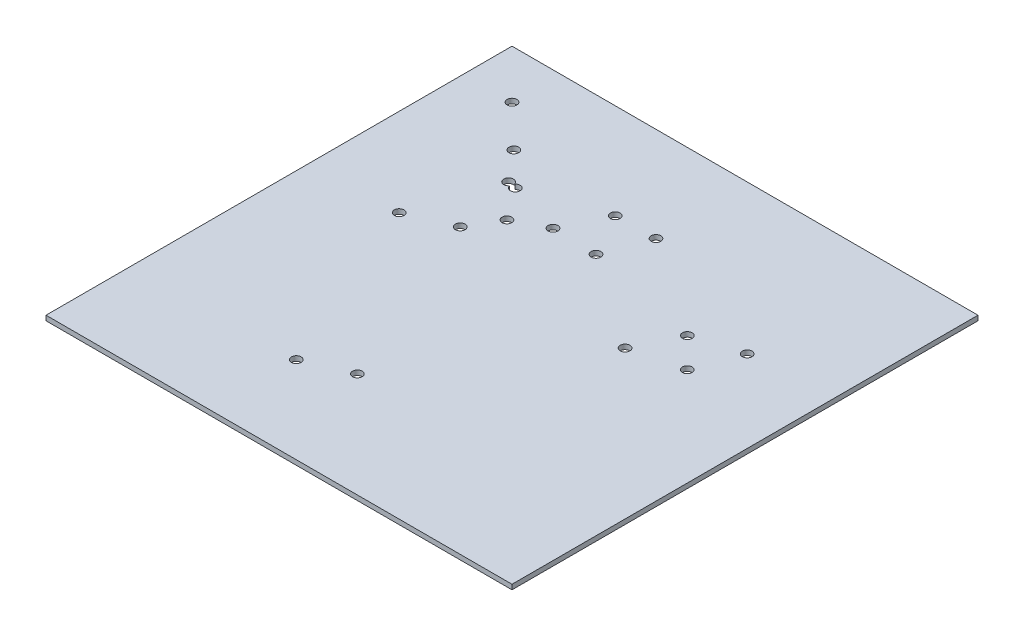
ISO-10303-21;
HEADER;
FILE_DESCRIPTION(('STEP AP214'),'2;1');
FILE_NAME('part.step','',(''),(''),'','','');
FILE_SCHEMA(('AUTOMOTIVE_DESIGN { 1 0 10303 214 1 1 1 1 }'));
ENDSEC;
DATA;
#1=APPLICATION_CONTEXT('core data for automotive mechanical design processes');
#2=APPLICATION_PROTOCOL_DEFINITION('international standard','automotive_design',2000,#1);
#3=PRODUCT_CONTEXT('',#1,'mechanical');
#4=PRODUCT('Part','Part','',(#3));
#5=PRODUCT_RELATED_PRODUCT_CATEGORY('part','',(#4));
#6=PRODUCT_DEFINITION_FORMATION('','',#4);
#7=PRODUCT_DEFINITION_CONTEXT('part definition',#1,'design');
#8=PRODUCT_DEFINITION('design','',#6,#7);
#9=PRODUCT_DEFINITION_SHAPE('','',#8);
#10=(LENGTH_UNIT() NAMED_UNIT(*) SI_UNIT(.MILLI.,.METRE.));
#11=(NAMED_UNIT(*) PLANE_ANGLE_UNIT() SI_UNIT($,.RADIAN.));
#12=(NAMED_UNIT(*) SI_UNIT($,.STERADIAN.) SOLID_ANGLE_UNIT());
#13=UNCERTAINTY_MEASURE_WITH_UNIT(LENGTH_MEASURE(1.E-05),#10,'distance_accuracy_value','');
#14=(GEOMETRIC_REPRESENTATION_CONTEXT(3) GLOBAL_UNCERTAINTY_ASSIGNED_CONTEXT((#13)) GLOBAL_UNIT_ASSIGNED_CONTEXT((#10,
#11,#12)) REPRESENTATION_CONTEXT('',''));
#15=CARTESIAN_POINT('',(0.,0.,0.));
#16=DIRECTION('',(0.,0.,1.));
#17=DIRECTION('',(1.,0.,0.));
#18=AXIS2_PLACEMENT_3D('',#15,#16,#17);
#19=CARTESIAN_POINT('',(-152.4,3.175,0.));
#20=DIRECTION('',(-1.,0.,0.));
#21=DIRECTION('',(0.,0.,1.));
#22=AXIS2_PLACEMENT_3D('',#19,#20,#21);
#23=PLANE('',#22);
#24=DIRECTION('',(0.,0.,-1.));
#25=VECTOR('',#24,1.);
#26=CARTESIAN_POINT('',(-152.4,0.,0.));
#27=LINE('',#26,#25);
#28=CARTESIAN_POINT('',(-152.4,0.,152.4));
#29=VERTEX_POINT('',#28);
#30=CARTESIAN_POINT('',(-152.4,0.,-152.4));
#31=VERTEX_POINT('',#30);
#32=EDGE_CURVE('E187',#29,#31,#27,.T.);
#33=ORIENTED_EDGE('',*,*,#32,.F.);
#34=DIRECTION('',(0.,-1.,0.));
#35=VECTOR('',#34,1.);
#36=CARTESIAN_POINT('',(-152.4,3.175,152.4));
#37=LINE('',#36,#35);
#38=CARTESIAN_POINT('',(-152.4,3.175,152.4));
#39=VERTEX_POINT('',#38);
#40=EDGE_CURVE('E11',#39,#29,#37,.T.);
#41=ORIENTED_EDGE('',*,*,#40,.F.);
#42=DIRECTION('',(0.,0.,-1.));
#43=VECTOR('',#42,1.);
#44=CARTESIAN_POINT('',(-152.4,3.175,0.));
#45=LINE('',#44,#43);
#46=CARTESIAN_POINT('',(-152.4,3.175,-152.4));
#47=VERTEX_POINT('',#46);
#48=EDGE_CURVE('E125',#39,#47,#45,.T.);
#49=ORIENTED_EDGE('',*,*,#48,.T.);
#50=DIRECTION('',(0.,-1.,0.));
#51=VECTOR('',#50,1.);
#52=CARTESIAN_POINT('',(-152.4,3.175,-152.4));
#53=LINE('',#52,#51);
#54=EDGE_CURVE('E90',#47,#31,#53,.T.);
#55=ORIENTED_EDGE('',*,*,#54,.T.);
#56=EDGE_LOOP('',(#33,#41,#49,#55));
#57=FACE_BOUND('',#56,.T.);
#58=ADVANCED_FACE('F39',(#57),#23,.T.);
#59=CARTESIAN_POINT('',(0.,3.175,152.4));
#60=DIRECTION('',(0.,0.,1.));
#61=DIRECTION('',(1.,0.,0.));
#62=AXIS2_PLACEMENT_3D('',#59,#60,#61);
#63=PLANE('',#62);
#64=DIRECTION('',(-1.,0.,0.));
#65=VECTOR('',#64,1.);
#66=CARTESIAN_POINT('',(0.,0.,152.4));
#67=LINE('',#66,#65);
#68=CARTESIAN_POINT('',(152.4,0.,152.4));
#69=VERTEX_POINT('',#68);
#70=EDGE_CURVE('E115',#69,#29,#67,.T.);
#71=ORIENTED_EDGE('',*,*,#70,.F.);
#72=DIRECTION('',(0.,-1.,0.));
#73=VECTOR('',#72,1.);
#74=CARTESIAN_POINT('',(152.4,3.175,152.4));
#75=LINE('',#74,#73);
#76=CARTESIAN_POINT('',(152.4,3.175,152.4));
#77=VERTEX_POINT('',#76);
#78=EDGE_CURVE('E49',#77,#69,#75,.T.);
#79=ORIENTED_EDGE('',*,*,#78,.F.);
#80=DIRECTION('',(-1.,0.,0.));
#81=VECTOR('',#80,1.);
#82=CARTESIAN_POINT('',(0.,3.175,152.4));
#83=LINE('',#82,#81);
#84=EDGE_CURVE('E113',#77,#39,#83,.T.);
#85=ORIENTED_EDGE('',*,*,#84,.T.);
#86=ORIENTED_EDGE('',*,*,#40,.T.);
#87=EDGE_LOOP('',(#71,#79,#85,#86));
#88=FACE_BOUND('',#87,.T.);
#89=ADVANCED_FACE('F111',(#88),#63,.T.);
#90=CARTESIAN_POINT('',(152.4,3.175,0.));
#91=DIRECTION('',(-1.,0.,0.));
#92=DIRECTION('',(0.,0.,1.));
#93=AXIS2_PLACEMENT_3D('',#90,#91,#92);
#94=PLANE('',#93);
#95=DIRECTION('',(0.,0.,-1.));
#96=VECTOR('',#95,1.);
#97=CARTESIAN_POINT('',(152.4,0.,0.));
#98=LINE('',#97,#96);
#99=CARTESIAN_POINT('',(152.4,0.,-152.4));
#100=VERTEX_POINT('',#99);
#101=EDGE_CURVE('E190',#69,#100,#98,.T.);
#102=ORIENTED_EDGE('',*,*,#101,.T.);
#103=DIRECTION('',(0.,-1.,0.));
#104=VECTOR('',#103,1.);
#105=CARTESIAN_POINT('',(152.4,3.175,-152.4));
#106=LINE('',#105,#104);
#107=CARTESIAN_POINT('',(152.4,3.175,-152.4));
#108=VERTEX_POINT('',#107);
#109=EDGE_CURVE('E118',#108,#100,#106,.T.);
#110=ORIENTED_EDGE('',*,*,#109,.F.);
#111=DIRECTION('',(0.,0.,-1.));
#112=VECTOR('',#111,1.);
#113=CARTESIAN_POINT('',(152.4,3.175,0.));
#114=LINE('',#113,#112);
#115=EDGE_CURVE('E121',#77,#108,#114,.T.);
#116=ORIENTED_EDGE('',*,*,#115,.F.);
#117=ORIENTED_EDGE('',*,*,#78,.T.);
#118=EDGE_LOOP('',(#102,#110,#116,#117));
#119=FACE_BOUND('',#118,.T.);
#120=ADVANCED_FACE('F122',(#119),#94,.F.);
#121=CARTESIAN_POINT('',(-70.9883003397646,3.175,-73.1341747517776));
#122=DIRECTION('',(0.,-1.,0.));
#123=DIRECTION('',(0.,0.,-1.));
#124=AXIS2_PLACEMENT_3D('',#121,#122,#123);
#125=CYLINDRICAL_SURFACE('',#124,3.175);
#126=CARTESIAN_POINT('',(-70.9883003397646,0.,-73.1341747517776));
#127=DIRECTION('',(0.,1.,0.));
#128=DIRECTION('',(0.,0.,1.));
#129=AXIS2_PLACEMENT_3D('',#126,#127,#128);
#130=CIRCLE('',#129,3.175);
#131=CARTESIAN_POINT('',(-74.1032331754784,0.,-72.5195053861898));
#132=VERTEX_POINT('',#131);
#133=CARTESIAN_POINT('',(-73.2823806353811,0.,-75.3291281902961));
#134=VERTEX_POINT('',#133);
#135=EDGE_CURVE('E133',#132,#134,#130,.T.);
#136=ORIENTED_EDGE('',*,*,#135,.F.);
#137=DIRECTION('',(0.,-1.,0.));
#138=VECTOR('',#137,1.);
#139=CARTESIAN_POINT('',(-74.1032331754784,3.175,-72.5195053861898));
#140=LINE('',#139,#138);
#141=CARTESIAN_POINT('',(-74.1032331754784,3.175,-72.5195053861898));
#142=VERTEX_POINT('',#141);
#143=EDGE_CURVE('E43',#142,#132,#140,.T.);
#144=ORIENTED_EDGE('',*,*,#143,.F.);
#145=CARTESIAN_POINT('',(-70.9883003397646,3.175,-73.1341747517776));
#146=DIRECTION('',(0.,1.,0.));
#147=DIRECTION('',(0.,0.,1.));
#148=AXIS2_PLACEMENT_3D('',#145,#146,#147);
#149=CIRCLE('',#148,3.175);
#150=CARTESIAN_POINT('',(-73.2823806353811,3.175,-75.3291281902961));
#151=VERTEX_POINT('',#150);
#152=EDGE_CURVE('E193',#142,#151,#149,.T.);
#153=ORIENTED_EDGE('',*,*,#152,.T.);
#154=DIRECTION('',(0.,-1.,0.));
#155=VECTOR('',#154,1.);
#156=CARTESIAN_POINT('',(-73.2823806353811,3.175,-75.3291281902961));
#157=LINE('',#156,#155);
#158=EDGE_CURVE('E132',#151,#134,#157,.T.);
#159=ORIENTED_EDGE('',*,*,#158,.T.);
#160=EDGE_LOOP('',(#136,#144,#153,#159));
#161=FACE_BOUND('',#160,.T.);
#162=ADVANCED_FACE('F41',(#161),#125,.F.);
#163=CARTESIAN_POINT('',(-76.6509639264033,3.175,-74.414153907893));
#164=DIRECTION('',(0.,-1.,0.));
#165=DIRECTION('',(0.,0.,-1.));
#166=AXIS2_PLACEMENT_3D('',#163,#164,#165);
#167=CYLINDRICAL_SURFACE('',#166,3.175);
#168=CARTESIAN_POINT('',(-76.6509639264033,0.,-74.414153907893));
#169=DIRECTION('',(0.,1.,0.));
#170=DIRECTION('',(0.,0.,1.));
#171=AXIS2_PLACEMENT_3D('',#168,#169,#170);
#172=CIRCLE('',#171,3.175);
#173=CARTESIAN_POINT('',(-73.812117445062,0.,-75.8359751538224));
#174=VERTEX_POINT('',#173);
#175=EDGE_CURVE('E136',#174,#132,#172,.T.);
#176=ORIENTED_EDGE('',*,*,#175,.F.);
#177=DIRECTION('',(0.,-1.,0.));
#178=VECTOR('',#177,1.);
#179=CARTESIAN_POINT('',(-73.812117445062,3.175,-75.8359751538224));
#180=LINE('',#179,#178);
#181=CARTESIAN_POINT('',(-73.812117445062,3.175,-75.8359751538224));
#182=VERTEX_POINT('',#181);
#183=EDGE_CURVE('E196',#182,#174,#180,.T.);
#184=ORIENTED_EDGE('',*,*,#183,.F.);
#185=CARTESIAN_POINT('',(-76.6509639264033,3.175,-74.414153907893));
#186=DIRECTION('',(0.,1.,0.));
#187=DIRECTION('',(0.,0.,1.));
#188=AXIS2_PLACEMENT_3D('',#185,#186,#187);
#189=CIRCLE('',#188,3.175);
#190=EDGE_CURVE('E205',#182,#142,#189,.T.);
#191=ORIENTED_EDGE('',*,*,#190,.T.);
#192=ORIENTED_EDGE('',*,*,#143,.T.);
#193=EDGE_LOOP('',(#176,#184,#191,#192));
#194=FACE_BOUND('',#193,.T.);
#195=ADVANCED_FACE('F203',(#194),#167,.F.);
#196=CARTESIAN_POINT('',(-120.65,3.175,-120.65));
#197=DIRECTION('',(0.,-1.,0.));
#198=DIRECTION('',(0.,0.,-1.));
#199=AXIS2_PLACEMENT_3D('',#196,#197,#198);
#200=CYLINDRICAL_SURFACE('',#199,3.175);
#201=CARTESIAN_POINT('',(-120.65,3.175,-120.65));
#202=DIRECTION('',(0.,1.,0.));
#203=DIRECTION('',(0.,0.,1.));
#204=AXIS2_PLACEMENT_3D('',#201,#202,#203);
#205=CIRCLE('',#204,3.175);
#206=CARTESIAN_POINT('',(-120.65,3.175,-117.475));
#207=VERTEX_POINT('',#206);
#208=EDGE_CURVE('E127',#207,#207,#205,.T.);
#209=ORIENTED_EDGE('',*,*,#208,.T.);
#210=EDGE_LOOP('',(#209));
#211=FACE_BOUND('',#210,.T.);
#212=CARTESIAN_POINT('',(-120.65,0.,-120.65));
#213=DIRECTION('',(0.,1.,0.));
#214=DIRECTION('',(0.,0.,1.));
#215=AXIS2_PLACEMENT_3D('',#212,#213,#214);
#216=CIRCLE('',#215,3.175);
#217=CARTESIAN_POINT('',(-120.65,0.,-117.475));
#218=VERTEX_POINT('',#217);
#219=EDGE_CURVE('E184',#218,#218,#216,.T.);
#220=ORIENTED_EDGE('',*,*,#219,.F.);
#221=EDGE_LOOP('',(#220));
#222=FACE_BOUND('',#221,.T.);
#223=ADVANCED_FACE('F261',(#211,#222),#200,.F.);
#224=CARTESIAN_POINT('',(3.66032493013951,3.175,-90.5136313441196));
#225=DIRECTION('',(0.,-1.,0.));
#226=DIRECTION('',(0.,0.,-1.));
#227=AXIS2_PLACEMENT_3D('',#224,#225,#226);
#228=CYLINDRICAL_SURFACE('',#227,3.175);
#229=CARTESIAN_POINT('',(3.66032493013951,3.175,-90.5136313441196));
#230=DIRECTION('',(0.,1.,0.));
#231=DIRECTION('',(0.,0.,1.));
#232=AXIS2_PLACEMENT_3D('',#229,#230,#231);
#233=CIRCLE('',#232,3.175);
#234=CARTESIAN_POINT('',(3.66032493013951,3.175,-87.3386313441196));
#235=VERTEX_POINT('',#234);
#236=EDGE_CURVE('E256',#235,#235,#233,.T.);
#237=ORIENTED_EDGE('',*,*,#236,.T.);
#238=EDGE_LOOP('',(#237));
#239=FACE_BOUND('',#238,.T.);
#240=CARTESIAN_POINT('',(3.66032493013951,0.,-90.5136313441196));
#241=DIRECTION('',(0.,1.,0.));
#242=DIRECTION('',(0.,0.,1.));
#243=AXIS2_PLACEMENT_3D('',#240,#241,#242);
#244=CIRCLE('',#243,3.175);
#245=CARTESIAN_POINT('',(3.66032493013951,0.,-87.3386313441196));
#246=VERTEX_POINT('',#245);
#247=EDGE_CURVE('E181',#246,#246,#244,.T.);
#248=ORIENTED_EDGE('',*,*,#247,.F.);
#249=EDGE_LOOP('',(#248));
#250=FACE_BOUND('',#249,.T.);
#251=ADVANCED_FACE('F285',(#239,#250),#228,.F.);
#252=CARTESIAN_POINT('',(-6.9990459643787,3.175,-61.9582778682284));
#253=DIRECTION('',(0.,-1.,0.));
#254=DIRECTION('',(0.,0.,-1.));
#255=AXIS2_PLACEMENT_3D('',#252,#253,#254);
#256=CYLINDRICAL_SURFACE('',#255,3.175);
#257=CARTESIAN_POINT('',(-6.9990459643787,3.175,-61.9582778682284));
#258=DIRECTION('',(0.,1.,0.));
#259=DIRECTION('',(0.,0.,1.));
#260=AXIS2_PLACEMENT_3D('',#257,#258,#259);
#261=CIRCLE('',#260,3.175);
#262=CARTESIAN_POINT('',(-6.9990459643787,3.175,-58.7832778682284));
#263=VERTEX_POINT('',#262);
#264=EDGE_CURVE('E253',#263,#263,#261,.T.);
#265=ORIENTED_EDGE('',*,*,#264,.T.);
#266=EDGE_LOOP('',(#265));
#267=FACE_BOUND('',#266,.T.);
#268=CARTESIAN_POINT('',(-6.9990459643787,0.,-61.9582778682284));
#269=DIRECTION('',(0.,1.,0.));
#270=DIRECTION('',(0.,0.,1.));
#271=AXIS2_PLACEMENT_3D('',#268,#269,#270);
#272=CIRCLE('',#271,3.175);
#273=CARTESIAN_POINT('',(-6.9990459643787,0.,-58.7832778682284));
#274=VERTEX_POINT('',#273);
#275=EDGE_CURVE('E178',#274,#274,#272,.T.);
#276=ORIENTED_EDGE('',*,*,#275,.F.);
#277=EDGE_LOOP('',(#276));
#278=FACE_BOUND('',#277,.T.);
#279=ADVANCED_FACE('F288',(#267,#278),#256,.F.);
#280=CARTESIAN_POINT('',(68.8754870335125,3.175,-45.7995667032588));
#281=DIRECTION('',(0.,-1.,0.));
#282=DIRECTION('',(0.,0.,-1.));
#283=AXIS2_PLACEMENT_3D('',#280,#281,#282);
#284=CYLINDRICAL_SURFACE('',#283,3.175);
#285=CARTESIAN_POINT('',(68.8754870335125,3.175,-45.7995667032588));
#286=DIRECTION('',(0.,1.,0.));
#287=DIRECTION('',(0.,0.,1.));
#288=AXIS2_PLACEMENT_3D('',#285,#286,#287);
#289=CIRCLE('',#288,3.175);
#290=CARTESIAN_POINT('',(68.8754870335125,3.175,-42.6245667032588));
#291=VERTEX_POINT('',#290);
#292=EDGE_CURVE('E250',#291,#291,#289,.T.);
#293=ORIENTED_EDGE('',*,*,#292,.T.);
#294=EDGE_LOOP('',(#293));
#295=FACE_BOUND('',#294,.T.);
#296=CARTESIAN_POINT('',(68.8754870335125,0.,-45.7995667032588));
#297=DIRECTION('',(0.,1.,0.));
#298=DIRECTION('',(0.,0.,1.));
#299=AXIS2_PLACEMENT_3D('',#296,#297,#298);
#300=CIRCLE('',#299,3.175);
#301=CARTESIAN_POINT('',(68.8754870335125,0.,-42.6245667032588));
#302=VERTEX_POINT('',#301);
#303=EDGE_CURVE('E175',#302,#302,#300,.T.);
#304=ORIENTED_EDGE('',*,*,#303,.F.);
#305=EDGE_LOOP('',(#304));
#306=FACE_BOUND('',#305,.T.);
#307=ADVANCED_FACE('F292',(#295,#306),#284,.F.);
#308=CARTESIAN_POINT('',(98.8448365164438,3.175,-54.9823950290588));
#309=DIRECTION('',(0.,-1.,0.));
#310=DIRECTION('',(0.,0.,-1.));
#311=AXIS2_PLACEMENT_3D('',#308,#309,#310);
#312=CYLINDRICAL_SURFACE('',#311,3.175);
#313=CARTESIAN_POINT('',(98.8448365164438,3.175,-54.9823950290588));
#314=DIRECTION('',(0.,1.,0.));
#315=DIRECTION('',(0.,0.,1.));
#316=AXIS2_PLACEMENT_3D('',#313,#314,#315);
#317=CIRCLE('',#316,3.175);
#318=CARTESIAN_POINT('',(98.8448365164438,3.175,-51.8073950290588));
#319=VERTEX_POINT('',#318);
#320=EDGE_CURVE('E247',#319,#319,#317,.T.);
#321=ORIENTED_EDGE('',*,*,#320,.T.);
#322=EDGE_LOOP('',(#321));
#323=FACE_BOUND('',#322,.T.);
#324=CARTESIAN_POINT('',(98.8448365164438,0.,-54.9823950290588));
#325=DIRECTION('',(0.,1.,0.));
#326=DIRECTION('',(0.,0.,1.));
#327=AXIS2_PLACEMENT_3D('',#324,#325,#326);
#328=CIRCLE('',#327,3.175);
#329=CARTESIAN_POINT('',(98.8448365164438,0.,-51.8073950290588));
#330=VERTEX_POINT('',#329);
#331=EDGE_CURVE('E172',#330,#330,#328,.T.);
#332=ORIENTED_EDGE('',*,*,#331,.F.);
#333=EDGE_LOOP('',(#332));
#334=FACE_BOUND('',#333,.T.);
#335=ADVANCED_FACE('F296',(#323,#334),#312,.F.);
#336=CARTESIAN_POINT('',(88.1854656219256,3.175,-26.4270415531676));
#337=DIRECTION('',(0.,-1.,0.));
#338=DIRECTION('',(0.,0.,-1.));
#339=AXIS2_PLACEMENT_3D('',#336,#337,#338);
#340=CYLINDRICAL_SURFACE('',#339,3.175);
#341=CARTESIAN_POINT('',(88.1854656219256,3.175,-26.4270415531676));
#342=DIRECTION('',(0.,1.,0.));
#343=DIRECTION('',(0.,0.,1.));
#344=AXIS2_PLACEMENT_3D('',#341,#342,#343);
#345=CIRCLE('',#344,3.175);
#346=CARTESIAN_POINT('',(88.1854656219256,3.175,-23.2520415531676));
#347=VERTEX_POINT('',#346);
#348=EDGE_CURVE('E244',#347,#347,#345,.T.);
#349=ORIENTED_EDGE('',*,*,#348,.T.);
#350=EDGE_LOOP('',(#349));
#351=FACE_BOUND('',#350,.T.);
#352=CARTESIAN_POINT('',(88.1854656219256,0.,-26.4270415531676));
#353=DIRECTION('',(0.,1.,0.));
#354=DIRECTION('',(0.,0.,1.));
#355=AXIS2_PLACEMENT_3D('',#352,#353,#354);
#356=CIRCLE('',#355,3.175);
#357=CARTESIAN_POINT('',(88.1854656219256,0.,-23.2520415531676));
#358=VERTEX_POINT('',#357);
#359=EDGE_CURVE('E169',#358,#358,#356,.T.);
#360=ORIENTED_EDGE('',*,*,#359,.F.);
#361=EDGE_LOOP('',(#360));
#362=FACE_BOUND('',#361,.T.);
#363=ADVANCED_FACE('F300',(#351,#362),#340,.F.);
#364=CARTESIAN_POINT('',(55.5904884270358,3.175,-18.3671185437178));
#365=DIRECTION('',(0.,-1.,0.));
#366=DIRECTION('',(0.,0.,-1.));
#367=AXIS2_PLACEMENT_3D('',#364,#365,#366);
#368=CYLINDRICAL_SURFACE('',#367,3.175);
#369=CARTESIAN_POINT('',(55.5904884270358,3.175,-18.3671185437178));
#370=DIRECTION('',(0.,1.,0.));
#371=DIRECTION('',(0.,0.,1.));
#372=AXIS2_PLACEMENT_3D('',#369,#370,#371);
#373=CIRCLE('',#372,3.175);
#374=CARTESIAN_POINT('',(55.5904884270358,3.175,-15.1921185437178));
#375=VERTEX_POINT('',#374);
#376=EDGE_CURVE('E241',#375,#375,#373,.T.);
#377=ORIENTED_EDGE('',*,*,#376,.T.);
#378=EDGE_LOOP('',(#377));
#379=FACE_BOUND('',#378,.T.);
#380=CARTESIAN_POINT('',(55.5904884270358,0.,-18.3671185437178));
#381=DIRECTION('',(0.,1.,0.));
#382=DIRECTION('',(0.,0.,1.));
#383=AXIS2_PLACEMENT_3D('',#380,#381,#382);
#384=CIRCLE('',#383,3.175);
#385=CARTESIAN_POINT('',(55.5904884270358,0.,-15.1921185437178));
#386=VERTEX_POINT('',#385);
#387=EDGE_CURVE('E166',#386,#386,#384,.T.);
#388=ORIENTED_EDGE('',*,*,#387,.F.);
#389=EDGE_LOOP('',(#388));
#390=FACE_BOUND('',#389,.T.);
#391=ADVANCED_FACE('F304',(#379,#390),#368,.F.);
#392=CARTESIAN_POINT('',(-35.8510054381013,3.175,-62.6504472319736));
#393=DIRECTION('',(0.,-1.,0.));
#394=DIRECTION('',(0.,0.,-1.));
#395=AXIS2_PLACEMENT_3D('',#392,#393,#394);
#396=CYLINDRICAL_SURFACE('',#395,3.175);
#397=CARTESIAN_POINT('',(-35.8510054381013,3.175,-62.6504472319736));
#398=DIRECTION('',(0.,1.,0.));
#399=DIRECTION('',(0.,0.,1.));
#400=AXIS2_PLACEMENT_3D('',#397,#398,#399);
#401=CIRCLE('',#400,3.175);
#402=CARTESIAN_POINT('',(-35.8510054381013,3.175,-59.4754472319736));
#403=VERTEX_POINT('',#402);
#404=EDGE_CURVE('E238',#403,#403,#401,.T.);
#405=ORIENTED_EDGE('',*,*,#404,.T.);
#406=EDGE_LOOP('',(#405));
#407=FACE_BOUND('',#406,.T.);
#408=CARTESIAN_POINT('',(-35.8510054381013,0.,-62.6504472319736));
#409=DIRECTION('',(0.,1.,0.));
#410=DIRECTION('',(0.,0.,1.));
#411=AXIS2_PLACEMENT_3D('',#408,#409,#410);
#412=CIRCLE('',#411,3.175);
#413=CARTESIAN_POINT('',(-35.8510054381013,0.,-59.4754472319736));
#414=VERTEX_POINT('',#413);
#415=EDGE_CURVE('E163',#414,#414,#412,.T.);
#416=ORIENTED_EDGE('',*,*,#415,.F.);
#417=EDGE_LOOP('',(#416));
#418=FACE_BOUND('',#417,.T.);
#419=ADVANCED_FACE('F308',(#407,#418),#396,.F.);
#420=CARTESIAN_POINT('',(-22.5660068316246,3.175,-90.0828953915147));
#421=DIRECTION('',(0.,-1.,0.));
#422=DIRECTION('',(0.,0.,-1.));
#423=AXIS2_PLACEMENT_3D('',#420,#421,#422);
#424=CYLINDRICAL_SURFACE('',#423,3.175);
#425=CARTESIAN_POINT('',(-22.5660068316246,3.175,-90.0828953915147));
#426=DIRECTION('',(0.,1.,0.));
#427=DIRECTION('',(0.,0.,1.));
#428=AXIS2_PLACEMENT_3D('',#425,#426,#427);
#429=CIRCLE('',#428,3.175);
#430=CARTESIAN_POINT('',(-22.5660068316246,3.175,-86.9078953915147));
#431=VERTEX_POINT('',#430);
#432=EDGE_CURVE('E235',#431,#431,#429,.T.);
#433=ORIENTED_EDGE('',*,*,#432,.T.);
#434=EDGE_LOOP('',(#433));
#435=FACE_BOUND('',#434,.T.);
#436=CARTESIAN_POINT('',(-22.5660068316246,0.,-90.0828953915147));
#437=DIRECTION('',(0.,1.,0.));
#438=DIRECTION('',(0.,0.,1.));
#439=AXIS2_PLACEMENT_3D('',#436,#437,#438);
#440=CIRCLE('',#439,3.175);
#441=CARTESIAN_POINT('',(-22.5660068316246,0.,-86.9078953915147));
#442=VERTEX_POINT('',#441);
#443=EDGE_CURVE('E160',#442,#442,#440,.T.);
#444=ORIENTED_EDGE('',*,*,#443,.F.);
#445=EDGE_LOOP('',(#444));
#446=FACE_BOUND('',#445,.T.);
#447=ADVANCED_FACE('F312',(#435,#446),#424,.F.);
#448=CARTESIAN_POINT('',(-66.9232233788741,3.175,-33.0814492874089));
#449=DIRECTION('',(0.,-1.,0.));
#450=DIRECTION('',(0.,0.,-1.));
#451=AXIS2_PLACEMENT_3D('',#448,#449,#450);
#452=CYLINDRICAL_SURFACE('',#451,3.175);
#453=CARTESIAN_POINT('',(-66.9232233788741,3.175,-33.0814492874089));
#454=DIRECTION('',(0.,1.,0.));
#455=DIRECTION('',(0.,0.,1.));
#456=AXIS2_PLACEMENT_3D('',#453,#454,#455);
#457=CIRCLE('',#456,3.175);
#458=CARTESIAN_POINT('',(-66.9232233788741,3.175,-29.9064492874089));
#459=VERTEX_POINT('',#458);
#460=EDGE_CURVE('E232',#459,#459,#457,.T.);
#461=ORIENTED_EDGE('',*,*,#460,.T.);
#462=EDGE_LOOP('',(#461));
#463=FACE_BOUND('',#462,.T.);
#464=CARTESIAN_POINT('',(-66.9232233788741,0.,-33.0814492874089));
#465=DIRECTION('',(0.,1.,0.));
#466=DIRECTION('',(0.,0.,1.));
#467=AXIS2_PLACEMENT_3D('',#464,#465,#466);
#468=CIRCLE('',#467,3.175);
#469=CARTESIAN_POINT('',(-66.9232233788741,0.,-29.9064492874089));
#470=VERTEX_POINT('',#469);
#471=EDGE_CURVE('E157',#470,#470,#468,.T.);
#472=ORIENTED_EDGE('',*,*,#471,.F.);
#473=EDGE_LOOP('',(#472));
#474=FACE_BOUND('',#473,.T.);
#475=ADVANCED_FACE('F316',(#463,#474),#452,.F.);
#476=CARTESIAN_POINT('',(-94.9802113121043,3.175,-21.1719644910557));
#477=DIRECTION('',(0.,-1.,0.));
#478=DIRECTION('',(0.,0.,-1.));
#479=AXIS2_PLACEMENT_3D('',#476,#477,#478);
#480=CYLINDRICAL_SURFACE('',#479,3.175);
#481=CARTESIAN_POINT('',(-94.9802113121043,3.175,-21.1719644910557));
#482=DIRECTION('',(0.,1.,0.));
#483=DIRECTION('',(0.,0.,1.));
#484=AXIS2_PLACEMENT_3D('',#481,#482,#483);
#485=CIRCLE('',#484,3.175);
#486=CARTESIAN_POINT('',(-94.9802113121043,3.175,-17.9969644910557));
#487=VERTEX_POINT('',#486);
#488=EDGE_CURVE('E229',#487,#487,#485,.T.);
#489=ORIENTED_EDGE('',*,*,#488,.T.);
#490=EDGE_LOOP('',(#489));
#491=FACE_BOUND('',#490,.T.);
#492=CARTESIAN_POINT('',(-94.9802113121043,0.,-21.1719644910557));
#493=DIRECTION('',(0.,1.,0.));
#494=DIRECTION('',(0.,0.,1.));
#495=AXIS2_PLACEMENT_3D('',#492,#493,#494);
#496=CIRCLE('',#495,3.175);
#497=CARTESIAN_POINT('',(-94.9802113121043,0.,-17.9969644910557));
#498=VERTEX_POINT('',#497);
#499=EDGE_CURVE('E154',#498,#498,#496,.T.);
#500=ORIENTED_EDGE('',*,*,#499,.F.);
#501=EDGE_LOOP('',(#500));
#502=FACE_BOUND('',#501,.T.);
#503=ADVANCED_FACE('F320',(#491,#502),#480,.F.);
#504=CARTESIAN_POINT('',(-17.3003700607356,3.175,83.8226671010507));
#505=DIRECTION('',(0.,-1.,0.));
#506=DIRECTION('',(0.,0.,-1.));
#507=AXIS2_PLACEMENT_3D('',#504,#505,#506);
#508=CYLINDRICAL_SURFACE('',#507,3.175);
#509=CARTESIAN_POINT('',(-17.3003700607356,3.175,83.8226671010507));
#510=DIRECTION('',(0.,1.,0.));
#511=DIRECTION('',(0.,0.,1.));
#512=AXIS2_PLACEMENT_3D('',#509,#510,#511);
#513=CIRCLE('',#512,3.175);
#514=CARTESIAN_POINT('',(-17.3003700607356,3.175,86.9976671010507));
#515=VERTEX_POINT('',#514);
#516=EDGE_CURVE('E226',#515,#515,#513,.T.);
#517=ORIENTED_EDGE('',*,*,#516,.T.);
#518=EDGE_LOOP('',(#517));
#519=FACE_BOUND('',#518,.T.);
#520=CARTESIAN_POINT('',(-17.3003700607356,0.,83.8226671010507));
#521=DIRECTION('',(0.,1.,0.));
#522=DIRECTION('',(0.,0.,1.));
#523=AXIS2_PLACEMENT_3D('',#520,#521,#522);
#524=CIRCLE('',#523,3.175);
#525=CARTESIAN_POINT('',(-17.3003700607356,0.,86.9976671010507));
#526=VERTEX_POINT('',#525);
#527=EDGE_CURVE('E151',#526,#526,#524,.T.);
#528=ORIENTED_EDGE('',*,*,#527,.F.);
#529=EDGE_LOOP('',(#528));
#530=FACE_BOUND('',#529,.T.);
#531=ADVANCED_FACE('F324',(#519,#530),#508,.F.);
#532=CARTESIAN_POINT('',(-45.3573579939658,3.175,95.7321518974039));
#533=DIRECTION('',(0.,-1.,0.));
#534=DIRECTION('',(0.,0.,-1.));
#535=AXIS2_PLACEMENT_3D('',#532,#533,#534);
#536=CYLINDRICAL_SURFACE('',#535,3.175);
#537=CARTESIAN_POINT('',(-45.3573579939658,3.175,95.7321518974039));
#538=DIRECTION('',(0.,1.,0.));
#539=DIRECTION('',(0.,0.,1.));
#540=AXIS2_PLACEMENT_3D('',#537,#538,#539);
#541=CIRCLE('',#540,3.175);
#542=CARTESIAN_POINT('',(-45.3573579939658,3.175,98.9071518974039));
#543=VERTEX_POINT('',#542);
#544=EDGE_CURVE('E223',#543,#543,#541,.T.);
#545=ORIENTED_EDGE('',*,*,#544,.T.);
#546=EDGE_LOOP('',(#545));
#547=FACE_BOUND('',#546,.T.);
#548=CARTESIAN_POINT('',(-45.3573579939658,0.,95.7321518974039));
#549=DIRECTION('',(0.,1.,0.));
#550=DIRECTION('',(0.,0.,1.));
#551=AXIS2_PLACEMENT_3D('',#548,#549,#550);
#552=CIRCLE('',#551,3.175);
#553=CARTESIAN_POINT('',(-45.3573579939658,0.,98.9071518974039));
#554=VERTEX_POINT('',#553);
#555=EDGE_CURVE('E148',#554,#554,#552,.T.);
#556=ORIENTED_EDGE('',*,*,#555,.F.);
#557=EDGE_LOOP('',(#556));
#558=FACE_BOUND('',#557,.T.);
#559=ADVANCED_FACE('F328',(#547,#558),#536,.F.);
#560=CARTESIAN_POINT('',(-55.6390663599303,3.175,-52.3340596903393));
#561=DIRECTION('',(0.,-1.,0.));
#562=DIRECTION('',(0.,0.,-1.));
#563=AXIS2_PLACEMENT_3D('',#560,#561,#562);
#564=CYLINDRICAL_SURFACE('',#563,3.175);
#565=CARTESIAN_POINT('',(-55.6390663599303,3.175,-52.3340596903393));
#566=DIRECTION('',(0.,1.,0.));
#567=DIRECTION('',(0.,0.,1.));
#568=AXIS2_PLACEMENT_3D('',#565,#566,#567);
#569=CIRCLE('',#568,3.175);
#570=CARTESIAN_POINT('',(-55.6390663599303,3.175,-49.1590596903393));
#571=VERTEX_POINT('',#570);
#572=EDGE_CURVE('E220',#571,#571,#569,.T.);
#573=ORIENTED_EDGE('',*,*,#572,.T.);
#574=EDGE_LOOP('',(#573));
#575=FACE_BOUND('',#574,.T.);
#576=CARTESIAN_POINT('',(-55.6390663599303,0.,-52.3340596903393));
#577=DIRECTION('',(0.,1.,0.));
#578=DIRECTION('',(0.,0.,1.));
#579=AXIS2_PLACEMENT_3D('',#576,#577,#578);
#580=CIRCLE('',#579,3.175);
#581=CARTESIAN_POINT('',(-55.6390663599303,0.,-49.1590596903393));
#582=VERTEX_POINT('',#581);
#583=EDGE_CURVE('E145',#582,#582,#580,.T.);
#584=ORIENTED_EDGE('',*,*,#583,.F.);
#585=EDGE_LOOP('',(#584));
#586=FACE_BOUND('',#585,.T.);
#587=ADVANCED_FACE('F332',(#575,#586),#564,.F.);
#588=CARTESIAN_POINT('',(-93.0114711776832,3.175,-94.2057277615549));
#589=DIRECTION('',(0.,-1.,0.));
#590=DIRECTION('',(0.,0.,-1.));
#591=AXIS2_PLACEMENT_3D('',#588,#589,#590);
#592=CYLINDRICAL_SURFACE('',#591,3.175);
#593=CARTESIAN_POINT('',(-93.0114711776832,3.175,-94.2057277615549));
#594=DIRECTION('',(0.,1.,0.));
#595=DIRECTION('',(0.,0.,1.));
#596=AXIS2_PLACEMENT_3D('',#593,#594,#595);
#597=CIRCLE('',#596,3.175);
#598=CARTESIAN_POINT('',(-93.0114711776832,3.175,-91.0307277615549));
#599=VERTEX_POINT('',#598);
#600=EDGE_CURVE('E217',#599,#599,#597,.T.);
#601=ORIENTED_EDGE('',*,*,#600,.T.);
#602=EDGE_LOOP('',(#601));
#603=FACE_BOUND('',#602,.T.);
#604=CARTESIAN_POINT('',(-93.0114711776832,0.,-94.2057277615549));
#605=DIRECTION('',(0.,1.,0.));
#606=DIRECTION('',(0.,0.,1.));
#607=AXIS2_PLACEMENT_3D('',#604,#605,#606);
#608=CIRCLE('',#607,3.175);
#609=CARTESIAN_POINT('',(-93.0114711776832,0.,-91.0307277615549));
#610=VERTEX_POINT('',#609);
#611=EDGE_CURVE('E142',#610,#610,#608,.T.);
#612=ORIENTED_EDGE('',*,*,#611,.F.);
#613=EDGE_LOOP('',(#612));
#614=FACE_BOUND('',#613,.T.);
#615=ADVANCED_FACE('F336',(#603,#614),#592,.F.);
#616=CARTESIAN_POINT('',(2.60409315332364,3.175,-2.72169727437223));
#617=DIRECTION('',(0.69132391764361,0.,-0.722544974997329));
#618=DIRECTION('',(-0.722544974997329,0.,-0.69132391764361));
#619=AXIS2_PLACEMENT_3D('',#616,#617,#618);
#620=PLANE('',#619);
#621=DIRECTION('',(0.722544974997329,0.,0.69132391764361));
#622=VECTOR('',#621,1.);
#623=CARTESIAN_POINT('',(2.60409315332364,0.,-2.72169727437223));
#624=LINE('',#623,#622);
#625=EDGE_CURVE('E139',#174,#134,#624,.T.);
#626=ORIENTED_EDGE('',*,*,#625,.T.);
#627=ORIENTED_EDGE('',*,*,#158,.F.);
#628=DIRECTION('',(0.722544974997329,0.,0.69132391764361));
#629=VECTOR('',#628,1.);
#630=CARTESIAN_POINT('',(2.60409315332364,3.175,-2.72169727437223));
#631=LINE('',#630,#629);
#632=EDGE_CURVE('E211',#182,#151,#631,.T.);
#633=ORIENTED_EDGE('',*,*,#632,.F.);
#634=ORIENTED_EDGE('',*,*,#183,.T.);
#635=EDGE_LOOP('',(#626,#627,#633,#634));
#636=FACE_BOUND('',#635,.T.);
#637=ADVANCED_FACE('F210',(#636),#620,.F.);
#638=CARTESIAN_POINT('',(0.,3.175,-152.4));
#639=DIRECTION('',(0.,0.,1.));
#640=DIRECTION('',(1.,0.,0.));
#641=AXIS2_PLACEMENT_3D('',#638,#639,#640);
#642=PLANE('',#641);
#643=DIRECTION('',(-1.,0.,0.));
#644=VECTOR('',#643,1.);
#645=CARTESIAN_POINT('',(0.,0.,-152.4));
#646=LINE('',#645,#644);
#647=EDGE_CURVE('E83',#100,#31,#646,.T.);
#648=ORIENTED_EDGE('',*,*,#647,.T.);
#649=ORIENTED_EDGE('',*,*,#54,.F.);
#650=DIRECTION('',(-1.,0.,0.));
#651=VECTOR('',#650,1.);
#652=CARTESIAN_POINT('',(0.,3.175,-152.4));
#653=LINE('',#652,#651);
#654=EDGE_CURVE('E58',#108,#47,#653,.T.);
#655=ORIENTED_EDGE('',*,*,#654,.F.);
#656=ORIENTED_EDGE('',*,*,#109,.T.);
#657=EDGE_LOOP('',(#648,#649,#655,#656));
#658=FACE_BOUND('',#657,.T.);
#659=ADVANCED_FACE('F265',(#658),#642,.F.);
#660=CARTESIAN_POINT('',(0.,3.175,0.));
#661=DIRECTION('',(0.,1.,0.));
#662=DIRECTION('',(0.,0.,1.));
#663=AXIS2_PLACEMENT_3D('',#660,#661,#662);
#664=PLANE('',#663);
#665=ORIENTED_EDGE('',*,*,#152,.F.);
#666=ORIENTED_EDGE('',*,*,#190,.F.);
#667=ORIENTED_EDGE('',*,*,#632,.T.);
#668=EDGE_LOOP('',(#665,#666,#667));
#669=FACE_BOUND('',#668,.T.);
#670=ORIENTED_EDGE('',*,*,#600,.F.);
#671=EDGE_LOOP('',(#670));
#672=FACE_BOUND('',#671,.T.);
#673=ORIENTED_EDGE('',*,*,#572,.F.);
#674=EDGE_LOOP('',(#673));
#675=FACE_BOUND('',#674,.T.);
#676=ORIENTED_EDGE('',*,*,#544,.F.);
#677=EDGE_LOOP('',(#676));
#678=FACE_BOUND('',#677,.T.);
#679=ORIENTED_EDGE('',*,*,#516,.F.);
#680=EDGE_LOOP('',(#679));
#681=FACE_BOUND('',#680,.T.);
#682=ORIENTED_EDGE('',*,*,#488,.F.);
#683=EDGE_LOOP('',(#682));
#684=FACE_BOUND('',#683,.T.);
#685=ORIENTED_EDGE('',*,*,#460,.F.);
#686=EDGE_LOOP('',(#685));
#687=FACE_BOUND('',#686,.T.);
#688=ORIENTED_EDGE('',*,*,#432,.F.);
#689=EDGE_LOOP('',(#688));
#690=FACE_BOUND('',#689,.T.);
#691=ORIENTED_EDGE('',*,*,#404,.F.);
#692=EDGE_LOOP('',(#691));
#693=FACE_BOUND('',#692,.T.);
#694=ORIENTED_EDGE('',*,*,#376,.F.);
#695=EDGE_LOOP('',(#694));
#696=FACE_BOUND('',#695,.T.);
#697=ORIENTED_EDGE('',*,*,#348,.F.);
#698=EDGE_LOOP('',(#697));
#699=FACE_BOUND('',#698,.T.);
#700=ORIENTED_EDGE('',*,*,#320,.F.);
#701=EDGE_LOOP('',(#700));
#702=FACE_BOUND('',#701,.T.);
#703=ORIENTED_EDGE('',*,*,#292,.F.);
#704=EDGE_LOOP('',(#703));
#705=FACE_BOUND('',#704,.T.);
#706=ORIENTED_EDGE('',*,*,#264,.F.);
#707=EDGE_LOOP('',(#706));
#708=FACE_BOUND('',#707,.T.);
#709=ORIENTED_EDGE('',*,*,#236,.F.);
#710=EDGE_LOOP('',(#709));
#711=FACE_BOUND('',#710,.T.);
#712=ORIENTED_EDGE('',*,*,#208,.F.);
#713=EDGE_LOOP('',(#712));
#714=FACE_BOUND('',#713,.T.);
#715=ORIENTED_EDGE('',*,*,#48,.F.);
#716=ORIENTED_EDGE('',*,*,#84,.F.);
#717=ORIENTED_EDGE('',*,*,#115,.T.);
#718=ORIENTED_EDGE('',*,*,#654,.T.);
#719=EDGE_LOOP('',(#715,#716,#717,#718));
#720=FACE_BOUND('',#719,.T.);
#721=ADVANCED_FACE('F124',(#669,#672,#675,#678,#681,#684,#687,#690,#693,#696,#699,#702,#705,
#708,#711,#714,#720),#664,.T.);
#722=CARTESIAN_POINT('',(0.,0.,0.));
#723=DIRECTION('',(0.,1.,0.));
#724=DIRECTION('',(0.,0.,1.));
#725=AXIS2_PLACEMENT_3D('',#722,#723,#724);
#726=PLANE('',#725);
#727=ORIENTED_EDGE('',*,*,#135,.T.);
#728=ORIENTED_EDGE('',*,*,#625,.F.);
#729=ORIENTED_EDGE('',*,*,#175,.T.);
#730=EDGE_LOOP('',(#727,#728,#729));
#731=FACE_BOUND('',#730,.T.);
#732=ORIENTED_EDGE('',*,*,#611,.T.);
#733=EDGE_LOOP('',(#732));
#734=FACE_BOUND('',#733,.T.);
#735=ORIENTED_EDGE('',*,*,#583,.T.);
#736=EDGE_LOOP('',(#735));
#737=FACE_BOUND('',#736,.T.);
#738=ORIENTED_EDGE('',*,*,#555,.T.);
#739=EDGE_LOOP('',(#738));
#740=FACE_BOUND('',#739,.T.);
#741=ORIENTED_EDGE('',*,*,#527,.T.);
#742=EDGE_LOOP('',(#741));
#743=FACE_BOUND('',#742,.T.);
#744=ORIENTED_EDGE('',*,*,#499,.T.);
#745=EDGE_LOOP('',(#744));
#746=FACE_BOUND('',#745,.T.);
#747=ORIENTED_EDGE('',*,*,#471,.T.);
#748=EDGE_LOOP('',(#747));
#749=FACE_BOUND('',#748,.T.);
#750=ORIENTED_EDGE('',*,*,#443,.T.);
#751=EDGE_LOOP('',(#750));
#752=FACE_BOUND('',#751,.T.);
#753=ORIENTED_EDGE('',*,*,#415,.T.);
#754=EDGE_LOOP('',(#753));
#755=FACE_BOUND('',#754,.T.);
#756=ORIENTED_EDGE('',*,*,#387,.T.);
#757=EDGE_LOOP('',(#756));
#758=FACE_BOUND('',#757,.T.);
#759=ORIENTED_EDGE('',*,*,#359,.T.);
#760=EDGE_LOOP('',(#759));
#761=FACE_BOUND('',#760,.T.);
#762=ORIENTED_EDGE('',*,*,#331,.T.);
#763=EDGE_LOOP('',(#762));
#764=FACE_BOUND('',#763,.T.);
#765=ORIENTED_EDGE('',*,*,#303,.T.);
#766=EDGE_LOOP('',(#765));
#767=FACE_BOUND('',#766,.T.);
#768=ORIENTED_EDGE('',*,*,#275,.T.);
#769=EDGE_LOOP('',(#768));
#770=FACE_BOUND('',#769,.T.);
#771=ORIENTED_EDGE('',*,*,#247,.T.);
#772=EDGE_LOOP('',(#771));
#773=FACE_BOUND('',#772,.T.);
#774=ORIENTED_EDGE('',*,*,#219,.T.);
#775=EDGE_LOOP('',(#774));
#776=FACE_BOUND('',#775,.T.);
#777=ORIENTED_EDGE('',*,*,#32,.T.);
#778=ORIENTED_EDGE('',*,*,#647,.F.);
#779=ORIENTED_EDGE('',*,*,#101,.F.);
#780=ORIENTED_EDGE('',*,*,#70,.T.);
#781=EDGE_LOOP('',(#777,#778,#779,#780));
#782=FACE_BOUND('',#781,.T.);
#783=ADVANCED_FACE('F208',(#731,#734,#737,#740,#743,#746,#749,#752,#755,#758,#761,#764,#767,
#770,#773,#776,#782),#726,.F.);
#784=CLOSED_SHELL('',(#58,#89,#120,#162,#195,#223,#251,#279,#307,#335,#363,#391,#419,#447,#475,
#503,#531,#559,#587,#615,#637,#659,#721,#783));
#785=MANIFOLD_SOLID_BREP('B2',#784);
#786=ADVANCED_BREP_SHAPE_REPRESENTATION('',(#18,#785),#14);
#787=SHAPE_DEFINITION_REPRESENTATION(#9,#786);
ENDSEC;
END-ISO-10303-21;
